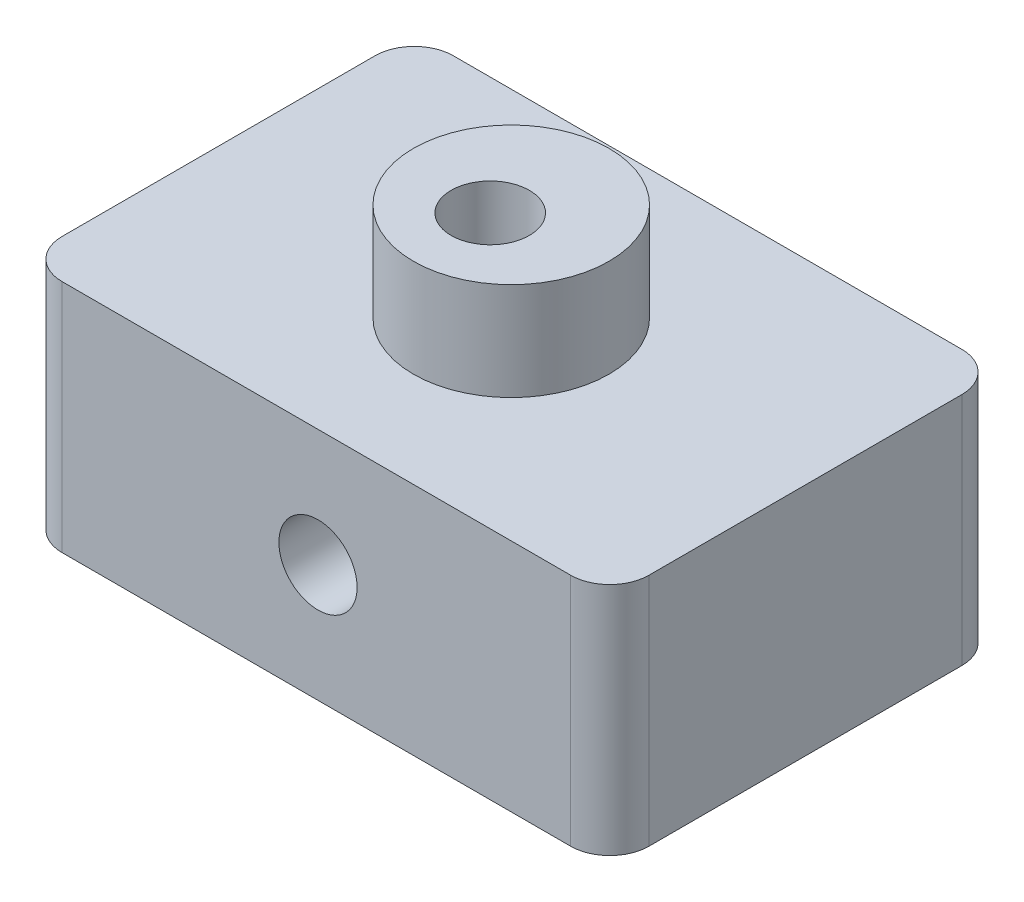
ISO-10303-21;
HEADER;
FILE_DESCRIPTION(('STEP AP214'),'2;1');
FILE_NAME('part.step','',(''),(''),'','','');
FILE_SCHEMA(('AUTOMOTIVE_DESIGN { 1 0 10303 214 1 1 1 1 }'));
ENDSEC;
DATA;
#1=APPLICATION_CONTEXT('core data for automotive mechanical design processes');
#2=APPLICATION_PROTOCOL_DEFINITION('international standard','automotive_design',2000,#1);
#3=PRODUCT_CONTEXT('',#1,'mechanical');
#4=PRODUCT('Part','Part','',(#3));
#5=PRODUCT_RELATED_PRODUCT_CATEGORY('part','',(#4));
#6=PRODUCT_DEFINITION_FORMATION('','',#4);
#7=PRODUCT_DEFINITION_CONTEXT('part definition',#1,'design');
#8=PRODUCT_DEFINITION('design','',#6,#7);
#9=PRODUCT_DEFINITION_SHAPE('','',#8);
#10=(LENGTH_UNIT() NAMED_UNIT(*) SI_UNIT(.MILLI.,.METRE.));
#11=(NAMED_UNIT(*) PLANE_ANGLE_UNIT() SI_UNIT($,.RADIAN.));
#12=(NAMED_UNIT(*) SI_UNIT($,.STERADIAN.) SOLID_ANGLE_UNIT());
#13=UNCERTAINTY_MEASURE_WITH_UNIT(LENGTH_MEASURE(1.E-05),#10,'distance_accuracy_value','');
#14=(GEOMETRIC_REPRESENTATION_CONTEXT(3) GLOBAL_UNCERTAINTY_ASSIGNED_CONTEXT((#13)) GLOBAL_UNIT_ASSIGNED_CONTEXT((#10,
#11,#12)) REPRESENTATION_CONTEXT('',''));
#15=CARTESIAN_POINT('',(0.,0.,0.));
#16=DIRECTION('',(0.,0.,1.));
#17=DIRECTION('',(1.,0.,0.));
#18=AXIS2_PLACEMENT_3D('',#15,#16,#17);
#19=CARTESIAN_POINT('',(-75.40625,30.,49.3984375));
#20=DIRECTION('',(0.,1.,0.));
#21=DIRECTION('',(0.,0.,1.));
#22=AXIS2_PLACEMENT_3D('',#19,#20,#21);
#23=PLANE('',#22);
#24=DIRECTION('',(0.,0.,1.));
#25=VECTOR('',#24,1.);
#26=CARTESIAN_POINT('',(-75.40625,30.,-50.6015625));
#27=LINE('',#26,#25);
#28=CARTESIAN_POINT('',(-75.40625,30.,-40.6015625));
#29=VERTEX_POINT('',#28);
#30=CARTESIAN_POINT('',(-75.40625,30.,39.3984375));
#31=VERTEX_POINT('',#30);
#32=EDGE_CURVE('E135',#29,#31,#27,.T.);
#33=ORIENTED_EDGE('',*,*,#32,.T.);
#34=CARTESIAN_POINT('',(-65.40625,30.,39.3984375));
#35=DIRECTION('',(0.,1.,0.));
#36=DIRECTION('',(0.,0.,1.));
#37=AXIS2_PLACEMENT_3D('',#34,#35,#36);
#38=CIRCLE('',#37,10.);
#39=CARTESIAN_POINT('',(-65.40625,30.,49.3984375));
#40=VERTEX_POINT('',#39);
#41=EDGE_CURVE('E199',#31,#40,#38,.T.);
#42=ORIENTED_EDGE('',*,*,#41,.T.);
#43=DIRECTION('',(1.,0.,0.));
#44=VECTOR('',#43,1.);
#45=CARTESIAN_POINT('',(-75.40625,30.,49.3984375));
#46=LINE('',#45,#44);
#47=CARTESIAN_POINT('',(64.59375,30.,49.3984375));
#48=VERTEX_POINT('',#47);
#49=EDGE_CURVE('E163',#40,#48,#46,.T.);
#50=ORIENTED_EDGE('',*,*,#49,.T.);
#51=CARTESIAN_POINT('',(64.59375,30.,39.3984375));
#52=DIRECTION('',(0.,1.,0.));
#53=DIRECTION('',(0.,0.,1.));
#54=AXIS2_PLACEMENT_3D('',#51,#52,#53);
#55=CIRCLE('',#54,10.);
#56=CARTESIAN_POINT('',(74.59375,30.,39.3984375));
#57=VERTEX_POINT('',#56);
#58=EDGE_CURVE('E70',#48,#57,#55,.T.);
#59=ORIENTED_EDGE('',*,*,#58,.T.);
#60=DIRECTION('',(0.,0.,-1.));
#61=VECTOR('',#60,1.);
#62=CARTESIAN_POINT('',(74.59375,30.,-50.6015625));
#63=LINE('',#62,#61);
#64=CARTESIAN_POINT('',(74.59375,30.,-40.6015625));
#65=VERTEX_POINT('',#64);
#66=EDGE_CURVE('E166',#57,#65,#63,.T.);
#67=ORIENTED_EDGE('',*,*,#66,.T.);
#68=CARTESIAN_POINT('',(64.59375,30.,-40.6015625));
#69=DIRECTION('',(0.,1.,0.));
#70=DIRECTION('',(0.,0.,1.));
#71=AXIS2_PLACEMENT_3D('',#68,#69,#70);
#72=CIRCLE('',#71,10.);
#73=CARTESIAN_POINT('',(64.59375,30.,-50.6015625));
#74=VERTEX_POINT('',#73);
#75=EDGE_CURVE('E194',#65,#74,#72,.T.);
#76=ORIENTED_EDGE('',*,*,#75,.T.);
#77=DIRECTION('',(-1.,0.,0.));
#78=VECTOR('',#77,1.);
#79=CARTESIAN_POINT('',(-75.40625,30.,-50.6015625));
#80=LINE('',#79,#78);
#81=CARTESIAN_POINT('',(-65.40625,30.,-50.6015625));
#82=VERTEX_POINT('',#81);
#83=EDGE_CURVE('E137',#74,#82,#80,.T.);
#84=ORIENTED_EDGE('',*,*,#83,.T.);
#85=CARTESIAN_POINT('',(-65.40625,30.,-40.6015625));
#86=DIRECTION('',(0.,1.,0.));
#87=DIRECTION('',(0.,0.,1.));
#88=AXIS2_PLACEMENT_3D('',#85,#86,#87);
#89=CIRCLE('',#88,10.);
#90=EDGE_CURVE('E173',#82,#29,#89,.T.);
#91=ORIENTED_EDGE('',*,*,#90,.T.);
#92=EDGE_LOOP('',(#33,#42,#50,#59,#67,#76,#84,#91));
#93=FACE_BOUND('',#92,.T.);
#94=CARTESIAN_POINT('',(0.,30.,0.));
#95=DIRECTION('',(0.,1.,0.));
#96=DIRECTION('',(0.,0.,1.));
#97=AXIS2_PLACEMENT_3D('',#94,#95,#96);
#98=CIRCLE('',#97,25.);
#99=CARTESIAN_POINT('',(0.,30.,25.));
#100=VERTEX_POINT('',#99);
#101=EDGE_CURVE('E152',#100,#100,#98,.T.);
#102=ORIENTED_EDGE('',*,*,#101,.F.);
#103=EDGE_LOOP('',(#102));
#104=FACE_BOUND('',#103,.T.);
#105=ADVANCED_FACE('F41',(#93,#104),#23,.T.);
#106=CARTESIAN_POINT('',(-75.40625,30.,-50.6015625));
#107=DIRECTION('',(1.,0.,0.));
#108=DIRECTION('',(0.,0.,-1.));
#109=AXIS2_PLACEMENT_3D('',#106,#107,#108);
#110=PLANE('',#109);
#111=DIRECTION('',(0.,0.,1.));
#112=VECTOR('',#111,1.);
#113=CARTESIAN_POINT('',(-75.40625,-30.,-50.6015625));
#114=LINE('',#113,#112);
#115=CARTESIAN_POINT('',(-75.40625,-30.,-40.6015625));
#116=VERTEX_POINT('',#115);
#117=CARTESIAN_POINT('',(-75.40625,-30.,39.3984375));
#118=VERTEX_POINT('',#117);
#119=EDGE_CURVE('E132',#116,#118,#114,.T.);
#120=ORIENTED_EDGE('',*,*,#119,.T.);
#121=DIRECTION('',(0.,-1.,0.));
#122=VECTOR('',#121,1.);
#123=CARTESIAN_POINT('',(-75.40625,30.,39.3984375));
#124=LINE('',#123,#122);
#125=EDGE_CURVE('E191',#118,#31,#124,.F.);
#126=ORIENTED_EDGE('',*,*,#125,.T.);
#127=ORIENTED_EDGE('',*,*,#32,.F.);
#128=DIRECTION('',(0.,-1.,0.));
#129=VECTOR('',#128,1.);
#130=CARTESIAN_POINT('',(-75.40625,30.,-40.6015625));
#131=LINE('',#130,#129);
#132=EDGE_CURVE('E120',#29,#116,#131,.T.);
#133=ORIENTED_EDGE('',*,*,#132,.T.);
#134=EDGE_LOOP('',(#120,#126,#127,#133));
#135=FACE_BOUND('',#134,.T.);
#136=ADVANCED_FACE('F131',(#135),#110,.F.);
#137=CARTESIAN_POINT('',(-75.40625,30.,49.3984375));
#138=DIRECTION('',(0.,0.,-1.));
#139=DIRECTION('',(-1.,0.,0.));
#140=AXIS2_PLACEMENT_3D('',#137,#138,#139);
#141=PLANE('',#140);
#142=CARTESIAN_POINT('',(0.,0.,49.3984375));
#143=DIRECTION('',(0.,0.,1.));
#144=DIRECTION('',(1.,0.,0.));
#145=AXIS2_PLACEMENT_3D('',#142,#143,#144);
#146=CIRCLE('',#145,10.);
#147=CARTESIAN_POINT('',(10.,0.,49.3984375));
#148=VERTEX_POINT('',#147);
#149=EDGE_CURVE('E267',#148,#148,#146,.T.);
#150=ORIENTED_EDGE('',*,*,#149,.F.);
#151=EDGE_LOOP('',(#150));
#152=FACE_BOUND('',#151,.T.);
#153=ORIENTED_EDGE('',*,*,#49,.F.);
#154=DIRECTION('',(0.,-1.,0.));
#155=VECTOR('',#154,1.);
#156=CARTESIAN_POINT('',(-65.40625,30.,49.3984375));
#157=LINE('',#156,#155);
#158=CARTESIAN_POINT('',(-65.40625,-30.,49.3984375));
#159=VERTEX_POINT('',#158);
#160=EDGE_CURVE('E179',#40,#159,#157,.T.);
#161=ORIENTED_EDGE('',*,*,#160,.T.);
#162=DIRECTION('',(1.,0.,0.));
#163=VECTOR('',#162,1.);
#164=CARTESIAN_POINT('',(-75.40625,-30.,49.3984375));
#165=LINE('',#164,#163);
#166=CARTESIAN_POINT('',(64.59375,-30.,49.3984375));
#167=VERTEX_POINT('',#166);
#168=EDGE_CURVE('E143',#159,#167,#165,.T.);
#169=ORIENTED_EDGE('',*,*,#168,.T.);
#170=DIRECTION('',(0.,-1.,0.));
#171=VECTOR('',#170,1.);
#172=CARTESIAN_POINT('',(64.59375,30.,49.3984375));
#173=LINE('',#172,#171);
#174=EDGE_CURVE('E176',#167,#48,#173,.F.);
#175=ORIENTED_EDGE('',*,*,#174,.T.);
#176=EDGE_LOOP('',(#153,#161,#169,#175));
#177=FACE_BOUND('',#176,.T.);
#178=ADVANCED_FACE('F223',(#152,#177),#141,.F.);
#179=CARTESIAN_POINT('',(74.59375,30.,-50.6015625));
#180=DIRECTION('',(-1.,0.,0.));
#181=DIRECTION('',(0.,0.,1.));
#182=AXIS2_PLACEMENT_3D('',#179,#180,#181);
#183=PLANE('',#182);
#184=ORIENTED_EDGE('',*,*,#66,.F.);
#185=DIRECTION('',(0.,-1.,0.));
#186=VECTOR('',#185,1.);
#187=CARTESIAN_POINT('',(74.59375,30.,39.3984375));
#188=LINE('',#187,#186);
#189=CARTESIAN_POINT('',(74.59375,-30.,39.3984375));
#190=VERTEX_POINT('',#189);
#191=EDGE_CURVE('E56',#57,#190,#188,.T.);
#192=ORIENTED_EDGE('',*,*,#191,.T.);
#193=DIRECTION('',(0.,0.,-1.));
#194=VECTOR('',#193,1.);
#195=CARTESIAN_POINT('',(74.59375,-30.,-50.6015625));
#196=LINE('',#195,#194);
#197=CARTESIAN_POINT('',(74.59375,-30.,-40.6015625));
#198=VERTEX_POINT('',#197);
#199=EDGE_CURVE('E149',#190,#198,#196,.T.);
#200=ORIENTED_EDGE('',*,*,#199,.T.);
#201=DIRECTION('',(0.,-1.,0.));
#202=VECTOR('',#201,1.);
#203=CARTESIAN_POINT('',(74.59375,30.,-40.6015625));
#204=LINE('',#203,#202);
#205=EDGE_CURVE('E63',#198,#65,#204,.F.);
#206=ORIENTED_EDGE('',*,*,#205,.T.);
#207=EDGE_LOOP('',(#184,#192,#200,#206));
#208=FACE_BOUND('',#207,.T.);
#209=ADVANCED_FACE('F208',(#208),#183,.F.);
#210=CARTESIAN_POINT('',(-75.40625,30.,-50.6015625));
#211=DIRECTION('',(0.,0.,1.));
#212=DIRECTION('',(1.,0.,0.));
#213=AXIS2_PLACEMENT_3D('',#210,#211,#212);
#214=PLANE('',#213);
#215=CARTESIAN_POINT('',(0.,0.,-50.6015625));
#216=DIRECTION('',(0.,0.,1.));
#217=DIRECTION('',(1.,0.,0.));
#218=AXIS2_PLACEMENT_3D('',#215,#216,#217);
#219=CIRCLE('',#218,10.);
#220=CARTESIAN_POINT('',(10.,0.,-50.6015625));
#221=VERTEX_POINT('',#220);
#222=EDGE_CURVE('E271',#221,#221,#219,.T.);
#223=ORIENTED_EDGE('',*,*,#222,.T.);
#224=EDGE_LOOP('',(#223));
#225=FACE_BOUND('',#224,.T.);
#226=ORIENTED_EDGE('',*,*,#83,.F.);
#227=DIRECTION('',(0.,-1.,0.));
#228=VECTOR('',#227,1.);
#229=CARTESIAN_POINT('',(64.59375,30.,-50.6015625));
#230=LINE('',#229,#228);
#231=CARTESIAN_POINT('',(64.59375,-30.,-50.6015625));
#232=VERTEX_POINT('',#231);
#233=EDGE_CURVE('E11',#74,#232,#230,.T.);
#234=ORIENTED_EDGE('',*,*,#233,.T.);
#235=DIRECTION('',(-1.,0.,0.));
#236=VECTOR('',#235,1.);
#237=CARTESIAN_POINT('',(-75.40625,-30.,-50.6015625));
#238=LINE('',#237,#236);
#239=CARTESIAN_POINT('',(-65.40625,-30.,-50.6015625));
#240=VERTEX_POINT('',#239);
#241=EDGE_CURVE('E158',#232,#240,#238,.T.);
#242=ORIENTED_EDGE('',*,*,#241,.T.);
#243=DIRECTION('',(0.,-1.,0.));
#244=VECTOR('',#243,1.);
#245=CARTESIAN_POINT('',(-65.40625,30.,-50.6015625));
#246=LINE('',#245,#244);
#247=EDGE_CURVE('E122',#240,#82,#246,.F.);
#248=ORIENTED_EDGE('',*,*,#247,.T.);
#249=EDGE_LOOP('',(#226,#234,#242,#248));
#250=FACE_BOUND('',#249,.T.);
#251=ADVANCED_FACE('F215',(#225,#250),#214,.F.);
#252=CARTESIAN_POINT('',(-75.40625,-30.,49.3984375));
#253=DIRECTION('',(0.,1.,0.));
#254=DIRECTION('',(0.,0.,1.));
#255=AXIS2_PLACEMENT_3D('',#252,#253,#254);
#256=PLANE('',#255);
#257=CARTESIAN_POINT('',(-0.899046964644157,-30.,4.46815099056152));
#258=DIRECTION('',(0.,1.,0.));
#259=DIRECTION('',(0.,0.,1.));
#260=AXIS2_PLACEMENT_3D('',#257,#258,#259);
#261=CIRCLE('',#260,10.);
#262=CARTESIAN_POINT('',(-0.899046964644157,-30.,14.4681509905615));
#263=VERTEX_POINT('',#262);
#264=EDGE_CURVE('E259',#263,#263,#261,.T.);
#265=ORIENTED_EDGE('',*,*,#264,.T.);
#266=EDGE_LOOP('',(#265));
#267=FACE_BOUND('',#266,.T.);
#268=ORIENTED_EDGE('',*,*,#168,.F.);
#269=CARTESIAN_POINT('',(-65.40625,-30.,39.3984375));
#270=DIRECTION('',(0.,1.,0.));
#271=DIRECTION('',(0.,0.,1.));
#272=AXIS2_PLACEMENT_3D('',#269,#270,#271);
#273=CIRCLE('',#272,10.);
#274=EDGE_CURVE('E141',#159,#118,#273,.F.);
#275=ORIENTED_EDGE('',*,*,#274,.T.);
#276=ORIENTED_EDGE('',*,*,#119,.F.);
#277=CARTESIAN_POINT('',(-65.40625,-30.,-40.6015625));
#278=DIRECTION('',(0.,1.,0.));
#279=DIRECTION('',(0.,0.,1.));
#280=AXIS2_PLACEMENT_3D('',#277,#278,#279);
#281=CIRCLE('',#280,10.);
#282=EDGE_CURVE('E116',#116,#240,#281,.F.);
#283=ORIENTED_EDGE('',*,*,#282,.T.);
#284=ORIENTED_EDGE('',*,*,#241,.F.);
#285=CARTESIAN_POINT('',(64.59375,-30.,-40.6015625));
#286=DIRECTION('',(0.,1.,0.));
#287=DIRECTION('',(0.,0.,1.));
#288=AXIS2_PLACEMENT_3D('',#285,#286,#287);
#289=CIRCLE('',#288,10.);
#290=EDGE_CURVE('E183',#232,#198,#289,.F.);
#291=ORIENTED_EDGE('',*,*,#290,.T.);
#292=ORIENTED_EDGE('',*,*,#199,.F.);
#293=CARTESIAN_POINT('',(64.59375,-30.,39.3984375));
#294=DIRECTION('',(0.,1.,0.));
#295=DIRECTION('',(0.,0.,1.));
#296=AXIS2_PLACEMENT_3D('',#293,#294,#295);
#297=CIRCLE('',#296,10.);
#298=EDGE_CURVE('E186',#190,#167,#297,.F.);
#299=ORIENTED_EDGE('',*,*,#298,.T.);
#300=EDGE_LOOP('',(#268,#275,#276,#283,#284,#291,#292,#299));
#301=FACE_BOUND('',#300,.T.);
#302=ADVANCED_FACE('F140',(#267,#301),#256,.F.);
#303=CARTESIAN_POINT('',(-65.40625,30.,-40.6015625));
#304=DIRECTION('',(0.,-1.,0.));
#305=DIRECTION('',(0.,0.,-1.));
#306=AXIS2_PLACEMENT_3D('',#303,#304,#305);
#307=CYLINDRICAL_SURFACE('',#306,10.);
#308=ORIENTED_EDGE('',*,*,#90,.F.);
#309=ORIENTED_EDGE('',*,*,#247,.F.);
#310=ORIENTED_EDGE('',*,*,#282,.F.);
#311=ORIENTED_EDGE('',*,*,#132,.F.);
#312=EDGE_LOOP('',(#308,#309,#310,#311));
#313=FACE_BOUND('',#312,.T.);
#314=ADVANCED_FACE('F119',(#313),#307,.T.);
#315=CARTESIAN_POINT('',(-65.40625,30.,39.3984375));
#316=DIRECTION('',(0.,-1.,0.));
#317=DIRECTION('',(0.,0.,-1.));
#318=AXIS2_PLACEMENT_3D('',#315,#316,#317);
#319=CYLINDRICAL_SURFACE('',#318,10.);
#320=ORIENTED_EDGE('',*,*,#41,.F.);
#321=ORIENTED_EDGE('',*,*,#125,.F.);
#322=ORIENTED_EDGE('',*,*,#274,.F.);
#323=ORIENTED_EDGE('',*,*,#160,.F.);
#324=EDGE_LOOP('',(#320,#321,#322,#323));
#325=FACE_BOUND('',#324,.T.);
#326=ADVANCED_FACE('F221',(#325),#319,.T.);
#327=CARTESIAN_POINT('',(64.59375,30.,39.3984375));
#328=DIRECTION('',(0.,-1.,0.));
#329=DIRECTION('',(0.,0.,-1.));
#330=AXIS2_PLACEMENT_3D('',#327,#328,#329);
#331=CYLINDRICAL_SURFACE('',#330,10.);
#332=ORIENTED_EDGE('',*,*,#58,.F.);
#333=ORIENTED_EDGE('',*,*,#174,.F.);
#334=ORIENTED_EDGE('',*,*,#298,.F.);
#335=ORIENTED_EDGE('',*,*,#191,.F.);
#336=EDGE_LOOP('',(#332,#333,#334,#335));
#337=FACE_BOUND('',#336,.T.);
#338=ADVANCED_FACE('F225',(#337),#331,.T.);
#339=CARTESIAN_POINT('',(64.59375,30.,-40.6015625));
#340=DIRECTION('',(0.,-1.,0.));
#341=DIRECTION('',(0.,0.,-1.));
#342=AXIS2_PLACEMENT_3D('',#339,#340,#341);
#343=CYLINDRICAL_SURFACE('',#342,10.);
#344=ORIENTED_EDGE('',*,*,#75,.F.);
#345=ORIENTED_EDGE('',*,*,#205,.F.);
#346=ORIENTED_EDGE('',*,*,#290,.F.);
#347=ORIENTED_EDGE('',*,*,#233,.F.);
#348=EDGE_LOOP('',(#344,#345,#346,#347));
#349=FACE_BOUND('',#348,.T.);
#350=ADVANCED_FACE('F43',(#349),#343,.T.);
#351=CARTESIAN_POINT('',(0.,55.,0.));
#352=DIRECTION('',(0.,-1.,0.));
#353=DIRECTION('',(0.,0.,-1.));
#354=AXIS2_PLACEMENT_3D('',#351,#352,#353);
#355=CYLINDRICAL_SURFACE('',#354,25.);
#356=CARTESIAN_POINT('',(0.,55.,0.));
#357=DIRECTION('',(0.,1.,0.));
#358=DIRECTION('',(0.,0.,1.));
#359=AXIS2_PLACEMENT_3D('',#356,#357,#358);
#360=CIRCLE('',#359,25.);
#361=CARTESIAN_POINT('',(0.,55.,25.));
#362=VERTEX_POINT('',#361);
#363=EDGE_CURVE('E144',#362,#362,#360,.T.);
#364=ORIENTED_EDGE('',*,*,#363,.F.);
#365=EDGE_LOOP('',(#364));
#366=FACE_BOUND('',#365,.T.);
#367=ORIENTED_EDGE('',*,*,#101,.T.);
#368=EDGE_LOOP('',(#367));
#369=FACE_BOUND('',#368,.T.);
#370=ADVANCED_FACE('F231',(#366,#369),#355,.T.);
#371=CARTESIAN_POINT('',(0.,55.,0.));
#372=DIRECTION('',(0.,1.,0.));
#373=DIRECTION('',(0.,0.,1.));
#374=AXIS2_PLACEMENT_3D('',#371,#372,#373);
#375=PLANE('',#374);
#376=CARTESIAN_POINT('',(-0.899046964644157,55.,4.46815099056153));
#377=DIRECTION('',(0.,1.,0.));
#378=DIRECTION('',(0.,0.,1.));
#379=AXIS2_PLACEMENT_3D('',#376,#377,#378);
#380=CIRCLE('',#379,10.);
#381=CARTESIAN_POINT('',(-0.899046964644157,55.,14.4681509905615));
#382=VERTEX_POINT('',#381);
#383=EDGE_CURVE('E262',#382,#382,#380,.T.);
#384=ORIENTED_EDGE('',*,*,#383,.F.);
#385=EDGE_LOOP('',(#384));
#386=FACE_BOUND('',#385,.T.);
#387=ORIENTED_EDGE('',*,*,#363,.T.);
#388=EDGE_LOOP('',(#387));
#389=FACE_BOUND('',#388,.T.);
#390=ADVANCED_FACE('F282',(#386,#389),#375,.T.);
#391=CARTESIAN_POINT('',(0.,0.,-50.6015625));
#392=DIRECTION('',(0.,0.,1.));
#393=DIRECTION('',(1.,0.,0.));
#394=AXIS2_PLACEMENT_3D('',#391,#392,#393);
#395=CYLINDRICAL_SURFACE('',#394,10.);
#396=CARTESIAN_POINT('',(-0.899046964644157,-9.95950373037553,14.4681509905615));
#397=CARTESIAN_POINT('',(-1.12752872132913,-9.93887776066188,14.4681501720457));
#398=CARTESIAN_POINT('',(-1.35530917914321,-9.91037418501054,14.4603045362663));
#399=CARTESIAN_POINT('',(-1.8073627376254,-9.83798033757983,14.4293913145589));
#400=CARTESIAN_POINT('',(-2.03163551995404,-9.79408867762082,14.4063223551488));
#401=CARTESIAN_POINT('',(-2.47494405674209,-9.69156605998227,14.3457335993016));
#402=CARTESIAN_POINT('',(-2.69397597686504,-9.63292465162603,14.3082035466376));
#403=CARTESIAN_POINT('',(-3.12505847881769,-9.50183006338828,14.2197302522666));
#404=CARTESIAN_POINT('',(-3.33710902258632,-9.42937680822194,14.1687869374468));
#405=CARTESIAN_POINT('',(-3.75133350389883,-9.27233395624769,14.0551332095124));
#406=CARTESIAN_POINT('',(-3.95357250247998,-9.18784530851439,13.9925194566098));
#407=CARTESIAN_POINT('',(-4.34913819536915,-9.00734622884316,13.8564756354057));
#408=CARTESIAN_POINT('',(-4.54246153999902,-8.91133151450973,13.7830415445959));
#409=CARTESIAN_POINT('',(-4.91946426052646,-8.70888301769295,13.6266380676515));
#410=CARTESIAN_POINT('',(-5.10314592471413,-8.60245172474266,13.5436709590604));
#411=CARTESIAN_POINT('',(-5.46054675074017,-8.38013927490348,13.3694015502728));
#412=CARTESIAN_POINT('',(-5.63426497694788,-8.2642572329954,13.2780984693548));
#413=CARTESIAN_POINT('',(-6.04586657700902,-7.97097744741656,13.0464923098745));
#414=CARTESIAN_POINT('',(-6.27830843509051,-7.78896687491552,12.9023204746952));
#415=CARTESIAN_POINT('',(-6.7219786880554,-7.40947168721188,12.6023509993643));
#416=CARTESIAN_POINT('',(-6.93320499260569,-7.21198555063367,12.4465522162599));
#417=CARTESIAN_POINT('',(-7.33537622017865,-6.8025637140968,12.1258281583448));
#418=CARTESIAN_POINT('',(-7.52625174647005,-6.59058237938061,11.9608744000381));
#419=CARTESIAN_POINT('',(-7.88726942141033,-6.15396018618728,11.6253470731709));
#420=CARTESIAN_POINT('',(-8.05741583286672,-5.92932194446384,11.4547746692449));
#421=CARTESIAN_POINT('',(-8.38175131851785,-5.46163246988378,11.1064681808757));
#422=CARTESIAN_POINT('',(-8.53538457822787,-5.21824761563851,10.928665154317));
#423=CARTESIAN_POINT('',(-8.8216137409636,-4.71828142665458,10.5742789464467));
#424=CARTESIAN_POINT('',(-8.95419721342818,-4.46169241198447,10.3976965443819));
#425=CARTESIAN_POINT('',(-9.19776197664706,-3.93511519308382,10.0516889425841));
#426=CARTESIAN_POINT('',(-9.30880969963753,-3.66517152612783,9.88224303688513));
#427=CARTESIAN_POINT('',(-9.50896726027526,-3.1091380643441,9.55788634089539));
#428=CARTESIAN_POINT('',(-9.59810732686215,-2.82307119500505,9.40295570680066));
#429=CARTESIAN_POINT('',(-9.74120206626696,-2.27527563559962,9.14096405060787));
#430=CARTESIAN_POINT('',(-9.79841069381291,-2.01620433523078,9.03021214732297));
#431=CARTESIAN_POINT('',(-9.89305740609979,-1.48323670443957,8.84069446228389));
#432=CARTESIAN_POINT('',(-9.9305564444556,-1.2093890030258,8.76183024176091));
#433=CARTESIAN_POINT('',(-9.9677014433478,-0.811838861770164,8.68243190351664));
#434=CARTESIAN_POINT('',(-9.97670349738577,-0.692693256763221,8.66295894105543));
#435=CARTESIAN_POINT('',(-9.99045127520171,-0.453051180236428,8.63308155841041));
#436=CARTESIAN_POINT('',(-9.99519897645126,-0.33255536270901,8.6226729250867));
#437=CARTESIAN_POINT('',(-10.0003144383401,-0.0910520999182125,8.61145552242331));
#438=CARTESIAN_POINT('',(-10.0006834665283,0.0299551871362666,8.61064397489626));
#439=CARTESIAN_POINT('',(-9.99704349916661,0.271567960278652,8.618628364735));
#440=CARTESIAN_POINT('',(-9.9930342938822,0.392173426840164,8.62742476235902));
#441=CARTESIAN_POINT('',(-9.97462258471623,0.750902059342588,8.66754355191235));
#442=CARTESIAN_POINT('',(-9.9538622109171,0.987264539226027,8.7125410133175));
#443=CARTESIAN_POINT('',(-9.8970082265562,1.45055091552425,8.83173748434465));
#444=CARTESIAN_POINT('',(-9.86088596987003,1.6774563044161,8.90599103023278));
#445=CARTESIAN_POINT('',(-9.77573775193287,2.11767448540971,9.07391954786902));
#446=CARTESIAN_POINT('',(-9.72688735193606,2.33112657994593,9.1673268567686));
#447=CARTESIAN_POINT('',(-9.61729062672283,2.74851695262215,9.36766954359782));
#448=CARTESIAN_POINT('',(-9.5565327712528,2.95244577025121,9.47461799790501));
#449=CARTESIAN_POINT('',(-9.42365406881742,3.35251324540667,9.69768337703965));
#450=CARTESIAN_POINT('',(-9.35148730148289,3.54861622713941,9.81383636446033));
#451=CARTESIAN_POINT('',(-9.19641749728701,3.93304318719408,10.051501979847));
#452=CARTESIAN_POINT('',(-9.11351710555228,4.12136906702464,10.1730132824948));
#453=CARTESIAN_POINT('',(-8.88468238243293,4.60100073059501,10.4920819330608));
#454=CARTESIAN_POINT('',(-8.73057959476742,4.8869485573883,10.6918918807748));
#455=CARTESIAN_POINT('',(-8.39543218850149,5.44260711306939,11.0917808223116));
#456=CARTESIAN_POINT('',(-8.21437269331627,5.71230876001349,11.2918599038576));
#457=CARTESIAN_POINT('',(-7.82524038184287,6.23469141825313,11.6864908217924));
#458=CARTESIAN_POINT('',(-7.61722720817767,6.48740819188566,11.8810537388212));
#459=CARTESIAN_POINT('',(-7.17348906196968,6.97493603724232,12.2602396782239));
#460=CARTESIAN_POINT('',(-6.93778019197356,7.20975738388424,12.4448683862899));
#461=CARTESIAN_POINT('',(-6.34030445726958,7.74716069267234,12.8689745132688));
#462=CARTESIAN_POINT('',(-5.96517232343683,8.04056093864152,13.1018443215725));
#463=CARTESIAN_POINT('',(-5.36229606712131,8.44418664960235,13.4197488978003));
#464=CARTESIAN_POINT('',(-5.15469464298465,8.5726234614656,13.5204636892519));
#465=CARTESIAN_POINT('',(-4.72636262158753,8.81601384449328,13.7097089524974));
#466=CARTESIAN_POINT('',(-4.50563433199181,8.9309697750594,13.7982415568693));
#467=CARTESIAN_POINT('',(-4.09163430245447,9.12696172399611,13.9469144674602));
#468=CARTESIAN_POINT('',(-3.90031198496216,9.21041389612394,14.0093123996501));
#469=CARTESIAN_POINT('',(-3.5100684790558,9.36608365826779,14.1234017426582));
#470=CARTESIAN_POINT('',(-3.31114891322011,9.43830363066678,14.1750954246528));
#471=CARTESIAN_POINT('',(-2.90673286215278,9.57058761126351,14.2667307845901));
#472=CARTESIAN_POINT('',(-2.70123875186298,9.63065595287173,14.3066766542512));
#473=CARTESIAN_POINT('',(-2.28484995948657,9.73784732855099,14.3739077719145));
#474=CARTESIAN_POINT('',(-2.07395522551284,9.78497023819624,14.4011928982289));
#475=CARTESIAN_POINT('',(-1.64715327601023,9.86581480348838,14.4424448200778));
#476=CARTESIAN_POINT('',(-1.43122553617637,9.89946469657433,14.456340837424));
#477=CARTESIAN_POINT('',(-0.997177838525335,9.95255930728309,14.4700264263113));
#478=CARTESIAN_POINT('',(-0.779057877263648,9.97200400258251,14.4698159756842));
#479=CARTESIAN_POINT('',(-0.342530530900321,9.99652221866937,14.4550412382879));
#480=CARTESIAN_POINT('',(-0.124123195537941,10.001597964427,14.4404791742751));
#481=CARTESIAN_POINT('',(0.311121743731859,9.99752780505092,14.3970641715529));
#482=CARTESIAN_POINT('',(0.527959418146211,9.98838254273736,14.3682118788325));
#483=CARTESIAN_POINT('',(0.940113074231852,9.95767197880945,14.2996002327798));
#484=CARTESIAN_POINT('',(1.13570201828736,9.93721901280944,14.2609657622795));
#485=CARTESIAN_POINT('',(1.52290149536898,9.8852890868938,14.1724603120924));
#486=CARTESIAN_POINT('',(1.71451050872853,9.85380799516885,14.1225851234474));
#487=CARTESIAN_POINT('',(2.09259145596435,9.78049806927775,14.0122006256859));
#488=CARTESIAN_POINT('',(2.2790636509396,9.73866976213204,13.9516918582207));
#489=CARTESIAN_POINT('',(2.64603030046163,9.64543324978079,13.8207122867682));
#490=CARTESIAN_POINT('',(2.82652361677944,9.5940232326618,13.7502395992005));
#491=CARTESIAN_POINT('',(3.23624082865954,9.4649968996132,13.57656301325));
#492=CARTESIAN_POINT('',(3.46305838871642,9.38421239663878,13.4700141833256));
#493=CARTESIAN_POINT('',(3.90409953459139,9.20946889982189,13.2426248361572));
#494=CARTESIAN_POINT('',(4.11831987515508,9.11550653206112,13.121780660131));
#495=CARTESIAN_POINT('',(4.53377848769374,8.91616543717024,12.8671891815681));
#496=CARTESIAN_POINT('',(4.73499910056535,8.8107716809422,12.7334249186204));
#497=CARTESIAN_POINT('',(5.12387947333737,8.59044992204739,12.4544921229063));
#498=CARTESIAN_POINT('',(5.31153575033986,8.47551948681643,12.3093206809625));
#499=CARTESIAN_POINT('',(5.73328177227402,8.19832722127144,11.9588347720858));
#500=CARTESIAN_POINT('',(5.96209234584853,8.03302348638401,11.7495592339438));
#501=CARTESIAN_POINT('',(6.39576858796833,7.69221969661563,11.3150456163857));
#502=CARTESIAN_POINT('',(6.60062440078934,7.5167154890935,11.089801027605));
#503=CARTESIAN_POINT('',(6.98707260219054,7.15892726530291,10.6245069639786));
#504=CARTESIAN_POINT('',(7.16863104233367,6.97663384363927,10.384436622733));
#505=CARTESIAN_POINT('',(7.50857170305036,6.60937806906413,9.89049841050262));
#506=CARTESIAN_POINT('',(7.66696147605697,6.42441660756613,9.63663507287904));
#507=CARTESIAN_POINT('',(7.92364956603674,6.10300895033039,9.18089767421163));
#508=CARTESIAN_POINT('',(8.02700518300127,5.9661443515906,8.98214828973194));
#509=CARTESIAN_POINT('',(8.22098587223987,5.69587891473713,8.57614979126611));
#510=CARTESIAN_POINT('',(8.3116082092034,5.56247882585682,8.36889886332914));
#511=CARTESIAN_POINT('',(8.47966220365949,5.3027518730922,7.94544714085758));
#512=CARTESIAN_POINT('',(8.5571218979527,5.17641036980898,7.72926662017244));
#513=CARTESIAN_POINT('',(8.69841873135576,4.93528175509704,7.28642760483769));
#514=CARTESIAN_POINT('',(8.76226634041413,4.8204857993954,7.05977732762429));
#515=CARTESIAN_POINT('',(8.87871213981503,4.60267330986984,6.57999814997514));
#516=CARTESIAN_POINT('',(8.93038910650131,4.50079899939036,6.32609726509153));
#517=CARTESIAN_POINT('',(8.99362896040524,4.37229402504466,5.93523381541878));
#518=CARTESIAN_POINT('',(9.01231953786744,4.33353338196456,5.80339676744175));
#519=CARTESIAN_POINT('',(9.04460932865696,4.26572937317561,5.53666680672957));
#520=CARTESIAN_POINT('',(9.05821145829027,4.23668044248003,5.40177569151126));
#521=CARTESIAN_POINT('',(9.08015786658702,4.18944314823695,5.12745979460326));
#522=CARTESIAN_POINT('',(9.08841655895881,4.17143180405117,4.98799710058076));
#523=CARTESIAN_POINT('',(9.09906400629718,4.14815656840205,4.70778636508065));
#524=CARTESIAN_POINT('',(9.10145357858755,4.14289090199852,4.56703850531341));
#525=CARTESIAN_POINT('',(9.10027782940319,4.14547285397512,4.28567831908544));
#526=CARTESIAN_POINT('',(9.09671202677805,4.15332153189766,4.14506600449415));
#527=CARTESIAN_POINT('',(9.0837525844227,4.18158738070306,3.86538574566258));
#528=CARTESIAN_POINT('',(9.07435781293052,4.20200699237263,3.72631810667785));
#529=CARTESIAN_POINT('',(9.04834653005581,4.25775670461375,3.43173634094674));
#530=CARTESIAN_POINT('',(9.03090935716294,4.29476154277437,3.27661517988908));
#531=CARTESIAN_POINT('',(8.98939927045305,4.38097917348195,2.97064977031847));
#532=CARTESIAN_POINT('',(8.96532062794601,4.43020250156938,2.81980933865348));
#533=CARTESIAN_POINT('',(8.91097093536738,4.53853207595211,2.52225337916416));
#534=CARTESIAN_POINT('',(8.8806767512803,4.59767508832469,2.37555566075653));
#535=CARTESIAN_POINT('',(8.81440972305888,4.72347906150661,2.08683105954024));
#536=CARTESIAN_POINT('',(8.7784380917754,4.79013841576259,1.94480318694305));
#537=CARTESIAN_POINT('',(8.66511235724525,4.99392509373147,1.5346187163911));
#538=CARTESIAN_POINT('',(8.58044441922296,5.1388081975648,1.27232651619635));
#539=CARTESIAN_POINT('',(8.39257070659741,5.44026349204004,0.7614060273382));
#540=CARTESIAN_POINT('',(8.28934829241861,5.59684610048731,0.512790267185026));
#541=CARTESIAN_POINT('',(8.06477436805724,5.91587174247253,0.0272605922931391));
#542=CARTESIAN_POINT('',(7.94339751045773,6.07832272505483,-0.20963633510076));
#543=CARTESIAN_POINT('',(7.6827492000504,6.4046071780279,-0.672199905862127));
#544=CARTESIAN_POINT('',(7.54348370035868,6.56844017163187,-0.897870250790956));
#545=CARTESIAN_POINT('',(7.23111144705451,6.91161486960791,-1.36166481115601));
#546=CARTESIAN_POINT('',(7.05598276646207,7.0907617040082,-1.59857725037982));
#547=CARTESIAN_POINT('',(6.68307282611027,7.44327942226584,-2.0586502472513));
#548=CARTESIAN_POINT('',(6.48528602618246,7.61664888005451,-2.28180742097651));
#549=CARTESIAN_POINT('',(6.06715186767056,7.95371730965856,-2.71251287263356));
#550=CARTESIAN_POINT('',(5.84686134278338,8.11743907332723,-2.92009828294488));
#551=CARTESIAN_POINT('',(5.38299338565449,8.43219423944663,-3.31833379576607));
#552=CARTESIAN_POINT('',(5.13941849436418,8.58322902301673,-3.50898574180248));
#553=CARTESIAN_POINT('',(4.70560244304516,8.82605619597699,-3.81652765861072));
#554=CARTESIAN_POINT('',(4.5212285909535,8.92204651211699,-3.93841129406425));
#555=CARTESIAN_POINT('',(4.14137073614002,9.10458303701718,-4.17151494689789));
#556=CARTESIAN_POINT('',(3.94588780375937,9.19113015327551,-4.28273598883582));
#557=CARTESIAN_POINT('',(3.54428920758468,9.35333663338446,-4.49333123734251));
#558=CARTESIAN_POINT('',(3.33817399808365,9.42899646190152,-4.59270594947829));
#559=CARTESIAN_POINT('',(2.91616675354917,9.5679301785299,-4.77832108621048));
#560=CARTESIAN_POINT('',(2.70027896689306,9.63120938631935,-4.86456714834512));
#561=CARTESIAN_POINT('',(2.25759259321558,9.74453613370665,-5.02350165579732));
#562=CARTESIAN_POINT('',(2.0307068904204,9.79444591383224,-5.0960468333437));
#563=CARTESIAN_POINT('',(1.56963268125913,9.87882414909283,-5.22529682916349));
#564=CARTESIAN_POINT('',(1.33544414863709,9.91329254870444,-5.28200159047838));
#565=CARTESIAN_POINT('',(0.861986311281206,9.96562340329663,-5.37852741987785));
#566=CARTESIAN_POINT('',(0.622721665338084,9.98350046395907,-5.41836332111924));
#567=CARTESIAN_POINT('',(0.141279970552815,10.0019017463968,-5.4805474852103));
#568=CARTESIAN_POINT('',(-0.100896610049729,10.0024287217057,-5.50289852243387));
#569=CARTESIAN_POINT('',(-0.551128884349061,9.98696947209982,-5.52796520835509));
#570=CARTESIAN_POINT('',(-0.759141234243734,9.9733199771243,-5.5330204104079));
#571=CARTESIAN_POINT('',(-1.17381899353699,9.93305248895833,-5.53022288035716));
#572=CARTESIAN_POINT('',(-1.38048443773996,9.90643483222585,-5.52237048312773));
#573=CARTESIAN_POINT('',(-1.79089983582396,9.8405224471073,-5.49412367204207));
#574=CARTESIAN_POINT('',(-1.99464982162749,9.80122785763709,-5.47372939561953));
#575=CARTESIAN_POINT('',(-2.39783782411535,9.71046228653817,-5.42098274872433));
#576=CARTESIAN_POINT('',(-2.59727568767075,9.65899087326755,-5.38862995432535));
#577=CARTESIAN_POINT('',(-2.98584819036527,9.5459239146587,-5.31364162436376));
#578=CARTESIAN_POINT('',(-3.17511539569333,9.48460404661519,-5.27127437559318));
#579=CARTESIAN_POINT('',(-3.54753376230369,9.35169039541698,-5.17666352540417));
#580=CARTESIAN_POINT('',(-3.73068273532066,9.2800929838523,-5.12441643390506));
#581=CARTESIAN_POINT('',(-4.0900540939458,9.1274075382897,-5.01092997990928));
#582=CARTESIAN_POINT('',(-4.26627760650345,9.04632105701973,-4.94969208819069));
#583=CARTESIAN_POINT('',(-4.61133285215738,8.87539851871297,-4.81909736903716));
#584=CARTESIAN_POINT('',(-4.78016303188054,8.78556063563028,-4.74973884655923));
#585=CARTESIAN_POINT('',(-5.18535714624085,8.55502457110068,-4.5704623711266));
#586=CARTESIAN_POINT('',(-5.41738252347281,8.40982471954389,-4.45647882624982));
#587=CARTESIAN_POINT('',(-5.86436513985539,8.10447725497535,-4.21574871360648));
#588=CARTESIAN_POINT('',(-6.0793158769352,7.94432399768912,-4.08899732508714));
#589=CARTESIAN_POINT('',(-6.4925083087393,7.6103935239835,-3.82482641326847));
#590=CARTESIAN_POINT('',(-6.69070220749701,7.43657989580621,-3.68737838828664));
#591=CARTESIAN_POINT('',(-7.06979582985457,7.07716165359826,-3.40444765463345));
#592=CARTESIAN_POINT('',(-7.25069666112717,6.89155779603639,-3.25896546151763));
#593=CARTESIAN_POINT('',(-7.64338627676313,6.45652883092444,-2.92091744247148));
#594=CARTESIAN_POINT('',(-7.84980632051779,6.20369142723049,-2.72649362182054));
#595=CARTESIAN_POINT('',(-8.23560354559937,5.68157632489975,-2.33265377604559));
#596=CARTESIAN_POINT('',(-8.41496436677164,5.41228881755684,-2.1332348151079));
#597=CARTESIAN_POINT('',(-8.74670929536977,4.85790871275608,-1.73516617638567));
#598=CARTESIAN_POINT('',(-8.89913970446903,4.57284437124225,-1.53651576408269));
#599=CARTESIAN_POINT('',(-9.17728060447975,3.98536973308971,-1.14682470268913));
#600=CARTESIAN_POINT('',(-9.30301714971321,3.68297671956096,-0.955776782661619));
#601=CARTESIAN_POINT('',(-9.50887523568473,3.10787022788635,-0.6213354117073));
#602=CARTESIAN_POINT('',(-9.59308438099113,2.83825431660559,-0.475229493270825));
#603=CARTESIAN_POINT('',(-9.70354651179545,2.42111081640641,-0.273865686658004));
#604=CARTESIAN_POINT('',(-9.73771780609612,2.27998508799782,-0.209726014560678));
#605=CARTESIAN_POINT('',(-9.80043290127964,1.99326507104566,-0.089251400795984));
#606=CARTESIAN_POINT('',(-9.82897752704469,1.84767144112865,-0.0329153154658486));
#607=CARTESIAN_POINT('',(-9.89656819572482,1.45568441799015,0.103107894831539));
#608=CARTESIAN_POINT('',(-9.93041822622275,1.2051576667005,0.174242761838169));
#609=CARTESIAN_POINT('',(-9.96693827114253,0.822543754409588,0.252209725288326));
#610=CARTESIAN_POINT('',(-9.97673349970574,0.693980567238454,0.273403651205212));
#611=CARTESIAN_POINT('',(-9.99135953042661,0.435293878807606,0.305199320648272));
#612=CARTESIAN_POINT('',(-9.99619286624242,0.305171208232022,0.315806469952538));
#613=CARTESIAN_POINT('',(-10.0007661361338,0.0435856908740094,0.325839998539298));
#614=CARTESIAN_POINT('',(-10.0004739676725,-0.0878804446181142,0.325195908113775));
#615=CARTESIAN_POINT('',(-9.99472868496654,-0.350150239371092,0.312598125042844));
#616=CARTESIAN_POINT('',(-9.98927542509916,-0.480953879834636,0.300644113282589));
#617=CARTESIAN_POINT('',(-9.97335557130354,-0.741078767456212,0.266094371735481));
#618=CARTESIAN_POINT('',(-9.96287912493476,-0.870396587729684,0.243477729810443));
#619=CARTESIAN_POINT('',(-9.93717642393124,-1.12654837022922,0.18876724649153));
#620=CARTESIAN_POINT('',(-9.92194817065532,-1.25338126337738,0.156669417551893));
#621=CARTESIAN_POINT('',(-9.8790569790849,-1.56149938083519,0.067829219105941));
#622=CARTESIAN_POINT('',(-9.84889322241531,-1.74112173188474,0.00653239294116332));
#623=CARTESIAN_POINT('',(-9.78001949438283,-2.09369060009373,-0.129032836874857));
#624=CARTESIAN_POINT('',(-9.7413042251965,-2.266632900461,-0.203309275656971));
#625=CARTESIAN_POINT('',(-9.65587663565562,-2.6067001476419,-0.361553897491607));
#626=CARTESIAN_POINT('',(-9.60913669240208,-2.7738025173643,-0.445555219352127));
#627=CARTESIAN_POINT('',(-9.50821304099062,-3.10216031326357,-0.62031148598434));
#628=CARTESIAN_POINT('',(-9.45402659018997,-3.26341355734626,-0.711068913444144));
#629=CARTESIAN_POINT('',(-9.34139661139201,-3.57267726078099,-0.892592434146814));
#630=CARTESIAN_POINT('',(-9.28329932097601,-3.72094733990082,-0.983133153823241));
#631=CARTESIAN_POINT('',(-9.16080557091675,-4.01306809425176,-1.16705750459749));
#632=CARTESIAN_POINT('',(-9.09640809738311,-4.15691805324061,-1.26044159160822));
#633=CARTESIAN_POINT('',(-8.89380830241537,-4.58247241688761,-1.54329542903429));
#634=CARTESIAN_POINT('',(-8.74624808726362,-4.85804650130567,-1.73538516915176));
#635=CARTESIAN_POINT('',(-8.42636605585891,-5.39384715719587,-2.1198775729529));
#636=CARTESIAN_POINT('',(-8.25405638583599,-5.65408116923331,-2.31228003763353));
#637=CARTESIAN_POINT('',(-7.88423901539733,-6.15927659228042,-2.69267408573619));
#638=CARTESIAN_POINT('',(-7.68674371634317,-6.40424543205195,-2.88066778645054));
#639=CARTESIAN_POINT('',(-7.30688273891775,-6.83187834412371,-3.21236331890229));
#640=CARTESIAN_POINT('',(-7.12903826554035,-7.01739740541597,-3.35757151876398));
#641=CARTESIAN_POINT('',(-6.75632292791481,-7.3769328855931,-3.6403026659772));
#642=CARTESIAN_POINT('',(-6.56145141523539,-7.55094886596885,-3.77782532031709));
#643=CARTESIAN_POINT('',(-6.1548963444904,-7.88584159833801,-4.04271409004001));
#644=CARTESIAN_POINT('',(-5.94324015966987,-8.04673890964721,-4.17009608995143));
#645=CARTESIAN_POINT('',(-5.50300715039792,-8.35397517699407,-4.41253843689678));
#646=CARTESIAN_POINT('',(-5.27443635288872,-8.50031927542114,-4.52760313736476));
#647=CARTESIAN_POINT('',(-4.85384973257961,-8.74559531712486,-4.71881393814318));
#648=CARTESIAN_POINT('',(-4.66508446987569,-8.84781284464867,-4.79791003802204));
#649=CARTESIAN_POINT('',(-4.27823339191784,-9.04120796855092,-4.94587831748132));
#650=CARTESIAN_POINT('',(-4.08015297044857,-9.13239184709074,-5.0147563199746));
#651=CARTESIAN_POINT('',(-3.67534368494282,-9.30269078462674,-5.14106973030874));
#652=CARTESIAN_POINT('',(-3.46861578095549,-9.3818071788554,-5.19850640431521));
#653=CARTESIAN_POINT('',(-3.04753153573862,-9.52691631446927,-5.30072536677955));
#654=CARTESIAN_POINT('',(-2.833175099347,-9.59290889207383,-5.34550749731606));
#655=CARTESIAN_POINT('',(-2.39655377873211,-9.71123415177271,-5.42158830609444));
#656=CARTESIAN_POINT('',(-2.17424109596699,-9.76345896846064,-5.45278169313166));
#657=CARTESIAN_POINT('',(-1.72500467059191,-9.85275581553845,-5.50023911353543));
#658=CARTESIAN_POINT('',(-1.49808091598832,-9.88982780650977,-5.5165031080648));
#659=CARTESIAN_POINT('',(-1.0417434926399,-9.9482490152576,-5.53343607590982));
#660=CARTESIAN_POINT('',(-0.812331070204867,-9.96960576486423,-5.53411252457387));
#661=CARTESIAN_POINT('',(-0.353092455718817,-9.99641006223518,-5.5195761937434));
#662=CARTESIAN_POINT('',(-0.123266307886081,-10.0018592196291,-5.50436502206911));
#663=CARTESIAN_POINT('',(0.307360710434871,-9.99731184505169,-5.46088245888555));
#664=CARTESIAN_POINT('',(0.508363647299215,-9.98907473575295,-5.43437893107521));
#665=CARTESIAN_POINT('',(0.907576924746791,-9.9607401079145,-5.36937942773226));
#666=CARTESIAN_POINT('',(1.10578720703087,-9.94064234214752,-5.33088320222797));
#667=CARTESIAN_POINT('',(1.49810523989151,-9.88912679773952,-5.24236416936542));
#668=CARTESIAN_POINT('',(1.69221298798755,-9.85770901225427,-5.19234135503803));
#669=CARTESIAN_POINT('',(2.07521885384531,-9.78424754299578,-5.0813780821542));
#670=CARTESIAN_POINT('',(2.26411668477578,-9.74220327547313,-5.02043702387443));
#671=CARTESIAN_POINT('',(2.6407404718498,-9.64703089957502,-4.88657476614047));
#672=CARTESIAN_POINT('',(2.82830113757876,-9.59363734594971,-4.81337765497808));
#673=CARTESIAN_POINT('',(3.19621713944517,-9.47741872228899,-4.65702398780897));
#674=CARTESIAN_POINT('',(3.37657032874234,-9.41459086824857,-4.57386449343278));
#675=CARTESIAN_POINT('',(3.90595804797733,-9.2133505139022,-4.31063367991659));
#676=CARTESIAN_POINT('',(4.24346460201472,-9.06214371503265,-4.11675803789801));
#677=CARTESIAN_POINT('',(4.8067213845822,-8.77325989800563,-3.74941841708568));
#678=CARTESIAN_POINT('',(5.03973002790865,-8.64118805208455,-3.58239861826082));
#679=CARTESIAN_POINT('',(5.4862512598825,-8.36480259562997,-3.23303486141325));
#680=CARTESIAN_POINT('',(5.69976127251058,-8.22048737243338,-3.05068888469912));
#681=CARTESIAN_POINT('',(6.10778945724682,-7.92205723335371,-2.67201435871069));
#682=CARTESIAN_POINT('',(6.30225701211946,-7.76791790609417,-2.47565082028424));
#683=CARTESIAN_POINT('',(6.67186473404092,-7.45286278766954,-2.0706895227244));
#684=CARTESIAN_POINT('',(6.84700792622214,-7.29194806262379,-1.86209368634847));
#685=CARTESIAN_POINT('',(7.18246014051705,-6.96196571954056,-1.42814624387498));
#686=CARTESIAN_POINT('',(7.34229578985731,-6.79279489651153,-1.20250800073545));
#687=CARTESIAN_POINT('',(7.64248049158447,-6.45320373652312,-0.739391501342763));
#688=CARTESIAN_POINT('',(7.78282357151085,-6.28278303336921,-0.501909646402761));
#689=CARTESIAN_POINT('',(8.04387756670488,-5.94487133616765,-0.0151792450114416));
#690=CARTESIAN_POINT('',(8.16462536130937,-5.77737538075431,0.234046031116919));
#691=CARTESIAN_POINT('',(8.38653835260043,-5.45022364329451,0.745828113497056));
#692=CARTESIAN_POINT('',(8.48771736996594,-5.29056238781392,1.00837534430633));
#693=CARTESIAN_POINT('',(8.66567569600464,-4.99346266449744,1.53720681775718));
#694=CARTESIAN_POINT('',(8.74333950587124,-4.85535193422878,1.80280648308682));
#695=CARTESIAN_POINT('',(8.87824406400651,-4.60402397902106,2.350596170481));
#696=CARTESIAN_POINT('',(8.93550907312046,-4.49077724460303,2.63276601656066));
#697=CARTESIAN_POINT('',(9.01857294250632,-4.32121246160401,3.16438357252798));
#698=CARTESIAN_POINT('',(9.04809765805114,-4.25844106016137,3.41106883027194));
#699=CARTESIAN_POINT('',(9.07851361461068,-4.19298597243116,3.78688830594367));
#700=CARTESIAN_POINT('',(9.08633965220167,-4.17595355476772,3.91301913925692));
#701=CARTESIAN_POINT('',(9.09720515670659,-4.1522334153111,4.16647869891988));
#702=CARTESIAN_POINT('',(9.1002448846907,-4.14554512929563,4.29380735955274));
#703=CARTESIAN_POINT('',(9.10144302248666,-4.14291415666308,4.54907781564238));
#704=CARTESIAN_POINT('',(9.09958318032619,-4.14701164938953,4.67702012641877));
#705=CARTESIAN_POINT('',(9.09100818010574,-4.16577284138788,4.93193361550519));
#706=CARTESIAN_POINT('',(9.08429282510326,-4.18043696924875,5.05890475421279));
#707=CARTESIAN_POINT('',(9.05707290689298,-4.23926560254668,5.43747408947474));
#708=CARTESIAN_POINT('',(9.02949350889808,-4.29826673309509,5.68635276795045));
#709=CARTESIAN_POINT('',(8.96588865068874,-4.42908232052659,6.11721759369772));
#710=CARTESIAN_POINT('',(8.93317076907402,-4.49500606978862,6.30163122083725));
#711=CARTESIAN_POINT('',(8.8587515653332,-4.6399542311858,6.66347489108542));
#712=CARTESIAN_POINT('',(8.81704398427696,-4.71898776191152,6.84089996621713));
#713=CARTESIAN_POINT('',(8.72521204856266,-4.88670083271274,7.18960106530832));
#714=CARTESIAN_POINT('',(8.67505839677524,-4.97541355655873,7.36085307594419));
#715=CARTESIAN_POINT('',(8.56689289573562,-5.15943304689294,7.69726872944891));
#716=CARTESIAN_POINT('',(8.50887822864162,-5.25474217189125,7.86243016197141));
#717=CARTESIAN_POINT('',(8.38939384174553,-5.44331648671607,8.17640881087177));
#718=CARTESIAN_POINT('',(8.32840913778721,-5.53629735470255,8.32558318517344));
#719=CARTESIAN_POINT('',(8.19997340595865,-5.72481140510801,8.61948025339163));
#720=CARTESIAN_POINT('',(8.13252142277843,-5.82034496308795,8.76420228545004));
#721=CARTESIAN_POINT('',(7.92047960819166,-6.10925383427978,9.19229455003383));
#722=CARTESIAN_POINT('',(7.76625360286127,-6.30485716098561,9.46946125767664));
#723=CARTESIAN_POINT('',(7.43225402190962,-6.69534921407452,10.0079761360488));
#724=CARTESIAN_POINT('',(7.25250076847689,-6.89023838359699,10.2693366562965));
#725=CARTESIAN_POINT('',(6.86690715871553,-7.27458847097189,10.7761822572724));
#726=CARTESIAN_POINT('',(6.66108027663791,-7.46405213103652,11.0216754396127));
#727=CARTESIAN_POINT('',(6.27165873802192,-7.79203949369753,11.4426628018084));
#728=CARTESIAN_POINT('',(6.0933512160296,-7.93249645332086,11.6215533153943));
#729=CARTESIAN_POINT('',(5.7203716777142,-8.20553166011737,11.9680227973322));
#730=CARTESIAN_POINT('',(5.52569938462273,-8.33810977397518,12.1356015742885));
#731=CARTESIAN_POINT('',(5.12022635062718,-8.59305277744335,12.4578513207098));
#732=CARTESIAN_POINT('',(4.90944970610494,-8.7154323745326,12.6125408779208));
#733=CARTESIAN_POINT('',(4.47173805742572,-8.94790015851382,12.9075984415487));
#734=CARTESIAN_POINT('',(4.24480861579446,-9.05799254352522,13.0479713380569));
#735=CARTESIAN_POINT('',(3.82558044895592,-9.24151060260696,13.284202476973));
#736=CARTESIAN_POINT('',(3.63625189070326,-9.31774305302361,13.3831611548891));
#737=CARTESIAN_POINT('',(3.2485728212895,-9.45988162944995,13.569991935725));
#738=CARTESIAN_POINT('',(3.05022751655812,-9.52579361936097,13.6578703286963));
#739=CARTESIAN_POINT('',(2.64528819837437,-9.64608945883266,13.8215116166765));
#740=CARTESIAN_POINT('',(2.43869741671354,-9.70047777334624,13.8972792013234));
#741=CARTESIAN_POINT('',(2.01828156283989,-9.79658196339387,14.0357083566871));
#742=CARTESIAN_POINT('',(1.8044568952095,-9.8382985463445,14.0983706589631));
#743=CARTESIAN_POINT('',(1.38664774901695,-9.90548786622339,14.2056404816665));
#744=CARTESIAN_POINT('',(1.18306804189188,-9.93191623800579,14.2512251652485));
#745=CARTESIAN_POINT('',(0.772256941677138,-9.97227186928104,14.329715943793));
#746=CARTESIAN_POINT('',(0.56502582939592,-9.98620008584702,14.362623009306));
#747=CARTESIAN_POINT('',(0.148467292120368,-10.001069052188,14.415350536731));
#748=CARTESIAN_POINT('',(-0.0608598065072384,-10.0020117934071,14.4351730048445));
#749=CARTESIAN_POINT('',(-0.480002929340024,-9.99067355654089,14.4615741047655));
#750=CARTESIAN_POINT('',(-0.689818989143228,-9.97839158360524,14.4681517401023));
#751=CARTESIAN_POINT('',(-0.899046964644157,-9.95950373037553,14.4681509905615));
#752=B_SPLINE_CURVE_WITH_KNOTS('',3,(#396,#397,#398,#399,#400,#401,#402,#403,#404,#405,#406,
#407,#408,#409,#410,#411,#412,#413,#414,#415,#416,#417,#418,#419,#420,#421,#422,#423,#424,#425,
#426,#427,#428,#429,#430,#431,#432,#433,#434,#435,#436,#437,#438,#439,#440,#441,#442,#443,#444,
#445,#446,#447,#448,#449,#450,#451,#452,#453,#454,#455,#456,#457,#458,#459,#460,#461,#462,#463,
#464,#465,#466,#467,#468,#469,#470,#471,#472,#473,#474,#475,#476,#477,#478,#479,#480,#481,#482,
#483,#484,#485,#486,#487,#488,#489,#490,#491,#492,#493,#494,#495,#496,#497,#498,#499,#500,#501,
#502,#503,#504,#505,#506,#507,#508,#509,#510,#511,#512,#513,#514,#515,#516,#517,#518,#519,#520,
#521,#522,#523,#524,#525,#526,#527,#528,#529,#530,#531,#532,#533,#534,#535,#536,#537,#538,#539,
#540,#541,#542,#543,#544,#545,#546,#547,#548,#549,#550,#551,#552,#553,#554,#555,#556,#557,#558,
#559,#560,#561,#562,#563,#564,#565,#566,#567,#568,#569,#570,#571,#572,#573,#574,#575,#576,#577,
#578,#579,#580,#581,#582,#583,#584,#585,#586,#587,#588,#589,#590,#591,#592,#593,#594,#595,#596,
#597,#598,#599,#600,#601,#602,#603,#604,#605,#606,#607,#608,#609,#610,#611,#612,#613,#614,#615,
#616,#617,#618,#619,#620,#621,#622,#623,#624,#625,#626,#627,#628,#629,#630,#631,#632,#633,#634,
#635,#636,#637,#638,#639,#640,#641,#642,#643,#644,#645,#646,#647,#648,#649,#650,#651,#652,#653,
#654,#655,#656,#657,#658,#659,#660,#661,#662,#663,#664,#665,#666,#667,#668,#669,#670,#671,#672,
#673,#674,#675,#676,#677,#678,#679,#680,#681,#682,#683,#684,#685,#686,#687,#688,#689,#690,#691,
#692,#693,#694,#695,#696,#697,#698,#699,#700,#701,#702,#703,#704,#705,#706,#707,#708,#709,#710,
#711,#712,#713,#714,#715,#716,#717,#718,#719,#720,#721,#722,#723,#724,#725,#726,#727,#728,#729,
#730,#731,#732,#733,#734,#735,#736,#737,#738,#739,#740,#741,#742,#743,#744,#745,#746,#747,#748,
#749,#750,#751),.UNSPECIFIED.,.T.,.F.,(4,2,2,2,2,2,2,2,2,2,2,2,2,2,2,2,2,2,2,2,2,2,2,2,2,2,2,2,
2,2,2,2,2,2,2,2,2,2,2,2,2,2,2,2,2,2,2,2,2,2,2,2,2,2,2,2,2,2,2,2,2,2,2,2,2,2,2,2,2,2,2,2,2,2,2,2,
2,2,2,2,2,2,2,2,2,2,2,2,2,2,2,2,2,2,2,2,2,2,2,2,2,2,2,2,2,2,2,2,2,2,2,2,2,2,2,2,2,2,2,2,2,2,2,2,
2,2,2,2,2,2,2,2,2,2,2,2,2,2,2,2,2,2,2,2,2,2,2,2,2,2,2,2,2,2,2,2,2,2,2,2,2,2,2,2,2,2,2,2,2,2,2,2,
2,2,2,2,2,4),(0.,0.687988142432876,1.37603836517163,2.0645774739697,2.75312033592468,
3.4361951929134,4.11952462966222,4.80269114955557,5.48592171847412,6.47009948055415,
7.4543741170991,8.44190448444697,9.42923142858502,10.4432526935483,11.4578705603738,
12.4693069916984,13.4793398722339,14.3399978975047,15.1979783651365,15.5608068305395,
15.9234665615318,16.2860213063462,16.6485934197159,17.3698061121682,18.0923696266339,
18.8054506682037,19.5192256443675,20.2359503220744,20.9524987096589,22.0951503054998,
23.2384348495307,24.379231428581,25.5193679891906,27.1030890350061,27.8945764803115,
28.6859251933897,29.3388750904115,29.9916863053892,30.6442643084397,31.2968485835625,
31.9528639580677,32.6088803634953,33.2647951820421,33.9206803526946,34.5212586389877,
35.1220621796608,35.7228351255733,36.3237217938877,37.1124637357259,37.9014079884547,
38.6914023530931,39.4815988483092,40.5342502953796,41.5873333230075,42.6419338637415,
43.6961898600589,44.4833276647507,45.270634301462,46.0562423401517,46.8412439184869,
47.6740246690321,48.0896898824287,48.5051165022645,48.9270423161699,49.3489093700632,
49.7708105093547,50.192793591295,50.6732819488443,51.1541860612857,51.6369136532265,
52.119538261188,53.0521345113921,53.9855713208799,54.9203237848044,55.8547659768583,
56.8881600725939,57.9218073864553,58.9529058759371,59.9838919729784,60.7061865010277,
61.4284115548155,62.1506057750889,62.8724889997294,63.6015469702499,64.3306075622622,
65.0590257374278,65.7873283089196,66.4121014717778,67.0368584258072,67.661608533883,
68.2863807913107,68.89600733726,69.5058496390685,70.1155922895293,70.7254624410217,
71.6136313552198,72.5021368812196,73.3930967478783,74.283999507597,75.4222514558266,
76.5611888629552,77.6981486150315,78.833993492617,79.7863372665767,80.262237886425,
80.7380686862028,81.5225058071931,81.9140598097617,82.3054137761278,82.6992197774806,
83.0930368905897,83.4876296132444,83.8823885284142,84.4579282607218,85.0338255558343,
85.6117465037141,86.1898808805186,86.7392331146886,87.288673902162,88.3880493496359,
89.4868870911763,90.585185841037,91.4699969171455,92.3548417037207,93.2382720022451,
94.1213890224383,94.8070894043795,95.4923975176979,96.1776297485497,96.8628705303245,
97.553330285536,98.2437918368982,98.933922255433,99.6239828398377,100.231996874502,
100.840023583251,101.448050659622,102.056111144286,102.680371055316,103.304815545011,
104.553236336185,105.499035368737,106.44495917326,107.393332737918,108.341557628159,
109.313208342737,110.285156114296,111.255252866266,112.224661953841,113.15099063014,
114.07621389113,114.841683004479,115.223780811063,115.605857775326,115.989360070858,
116.372877922346,117.141023925747,117.735931956935,118.331255528726,118.928688335559,
119.52633586615,120.084309455914,120.642365593739,121.758957434898,122.874665291511,
123.989798910293,124.856107820354,125.722431384773,126.587483170792,127.452238487562,
128.132092912596,128.811559643707,129.49076262586,130.169927683616,130.800037680741,
131.430099429441,132.060064551206,132.690077066421),.UNSPECIFIED.);
#753=CARTESIAN_POINT('',(-0.899046964644157,-9.95950373037553,14.4681509905615));
#754=VERTEX_POINT('',#753);
#755=EDGE_CURVE('E45',#754,#754,#752,.T.);
#756=ORIENTED_EDGE('',*,*,#755,.T.);
#757=EDGE_LOOP('',(#756));
#758=FACE_BOUND('',#757,.T.);
#759=ORIENTED_EDGE('',*,*,#222,.F.);
#760=EDGE_LOOP('',(#759));
#761=FACE_BOUND('',#760,.T.);
#762=ORIENTED_EDGE('',*,*,#149,.T.);
#763=EDGE_LOOP('',(#762));
#764=FACE_BOUND('',#763,.T.);
#765=ADVANCED_FACE('F279',(#758,#761,#764),#395,.F.);
#766=CARTESIAN_POINT('',(-0.899046964644157,-30.,4.46815099056152));
#767=DIRECTION('',(0.,1.,0.));
#768=DIRECTION('',(0.,0.,1.));
#769=AXIS2_PLACEMENT_3D('',#766,#767,#768);
#770=CYLINDRICAL_SURFACE('',#769,10.);
#771=ORIENTED_EDGE('',*,*,#383,.T.);
#772=EDGE_LOOP('',(#771));
#773=FACE_BOUND('',#772,.T.);
#774=ORIENTED_EDGE('',*,*,#264,.F.);
#775=EDGE_LOOP('',(#774));
#776=FACE_BOUND('',#775,.T.);
#777=ORIENTED_EDGE('',*,*,#755,.F.);
#778=EDGE_LOOP('',(#777));
#779=FACE_BOUND('',#778,.T.);
#780=ADVANCED_FACE('F281',(#773,#776,#779),#770,.F.);
#781=CLOSED_SHELL('',(#105,#136,#178,#209,#251,#302,#314,#326,#338,#350,#370,#390,#765,#780));
#782=MANIFOLD_SOLID_BREP('B2',#781);
#783=ADVANCED_BREP_SHAPE_REPRESENTATION('',(#18,#782),#14);
#784=SHAPE_DEFINITION_REPRESENTATION(#9,#783);
ENDSEC;
END-ISO-10303-21;
